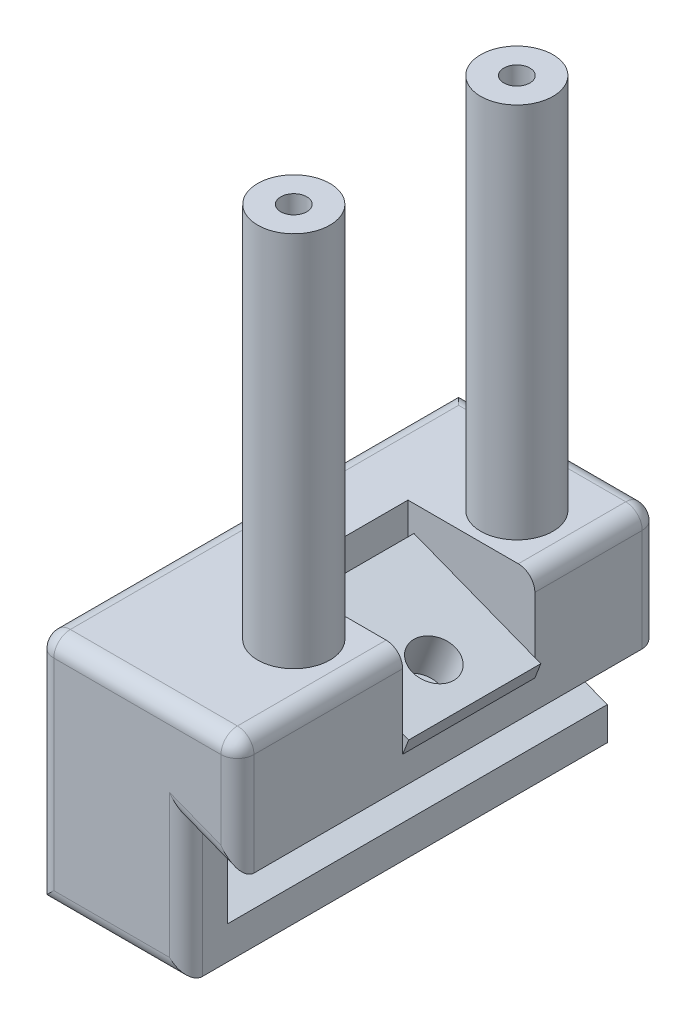
ISO-10303-21;
HEADER;
FILE_DESCRIPTION(('STEP AP214'),'2;1');
FILE_NAME('part.step','',(''),(''),'','','');
FILE_SCHEMA(('AUTOMOTIVE_DESIGN { 1 0 10303 214 1 1 1 1 }'));
ENDSEC;
DATA;
#1=APPLICATION_CONTEXT('core data for automotive mechanical design processes');
#2=APPLICATION_PROTOCOL_DEFINITION('international standard','automotive_design',2000,#1);
#3=PRODUCT_CONTEXT('',#1,'mechanical');
#4=PRODUCT('Part','Part','',(#3));
#5=PRODUCT_RELATED_PRODUCT_CATEGORY('part','',(#4));
#6=PRODUCT_DEFINITION_FORMATION('','',#4);
#7=PRODUCT_DEFINITION_CONTEXT('part definition',#1,'design');
#8=PRODUCT_DEFINITION('design','',#6,#7);
#9=PRODUCT_DEFINITION_SHAPE('','',#8);
#10=(LENGTH_UNIT() NAMED_UNIT(*) SI_UNIT(.MILLI.,.METRE.));
#11=(NAMED_UNIT(*) PLANE_ANGLE_UNIT() SI_UNIT($,.RADIAN.));
#12=(NAMED_UNIT(*) SI_UNIT($,.STERADIAN.) SOLID_ANGLE_UNIT());
#13=UNCERTAINTY_MEASURE_WITH_UNIT(LENGTH_MEASURE(1.E-05),#10,'distance_accuracy_value','');
#14=(GEOMETRIC_REPRESENTATION_CONTEXT(3) GLOBAL_UNCERTAINTY_ASSIGNED_CONTEXT((#13)) GLOBAL_UNIT_ASSIGNED_CONTEXT((#10,
#11,#12)) REPRESENTATION_CONTEXT('',''));
#15=CARTESIAN_POINT('',(0.,0.,0.));
#16=DIRECTION('',(0.,0.,1.));
#17=DIRECTION('',(1.,0.,0.));
#18=AXIS2_PLACEMENT_3D('',#15,#16,#17);
#19=CARTESIAN_POINT('',(0.,0.,39.37));
#20=DIRECTION('',(0.,0.,1.));
#21=DIRECTION('',(1.,0.,0.));
#22=AXIS2_PLACEMENT_3D('',#19,#20,#21);
#23=PLANE('',#22);
#24=DIRECTION('',(0.932004671541296,-0.362446261154948,0.));
#25=VECTOR('',#24,1.);
#26=CARTESIAN_POINT('',(31.6954077576272,24.4751367167012,39.37));
#27=LINE('',#26,#25);
#28=CARTESIAN_POINT('',(12.1920469111093,32.0597770459026,39.37));
#29=VERTEX_POINT('',#28);
#30=CARTESIAN_POINT('',(30.7747942542936,24.8331530791087,39.37));
#31=VERTEX_POINT('',#30);
#32=EDGE_CURVE('E58',#29,#31,#27,.T.);
#33=ORIENTED_EDGE('',*,*,#32,.F.);
#34=DIRECTION('',(-0.362446261154949,-0.932004671541296,0.));
#35=VECTOR('',#34,1.);
#36=CARTESIAN_POINT('',(12.1920469111093,32.0597770459026,39.37));
#37=LINE('',#36,#35);
#38=CARTESIAN_POINT('',(11.2714334077757,29.6924851801877,39.37));
#39=VERTEX_POINT('',#38);
#40=EDGE_CURVE('E235',#29,#39,#37,.T.);
#41=ORIENTED_EDGE('',*,*,#40,.T.);
#42=DIRECTION('',(0.,-1.,0.));
#43=VECTOR('',#42,1.);
#44=CARTESIAN_POINT('',(11.2714334077757,36.0424851801877,39.37));
#45=LINE('',#44,#43);
#46=CARTESIAN_POINT('',(11.2714334077757,36.0424851801877,39.37));
#47=VERTEX_POINT('',#46);
#48=EDGE_CURVE('E249',#47,#39,#45,.T.);
#49=ORIENTED_EDGE('',*,*,#48,.F.);
#50=DIRECTION('',(-1.,0.,0.));
#51=VECTOR('',#50,1.);
#52=CARTESIAN_POINT('',(30.7747942542936,36.0424851801877,39.37));
#53=LINE('',#52,#51);
#54=CARTESIAN_POINT('',(28.2347942542936,36.0424851801877,39.37));
#55=VERTEX_POINT('',#54);
#56=EDGE_CURVE('E239',#55,#47,#53,.T.);
#57=ORIENTED_EDGE('',*,*,#56,.F.);
#58=CARTESIAN_POINT('',(28.2347942542936,33.5024851801877,39.37));
#59=DIRECTION('',(0.,0.,1.));
#60=DIRECTION('',(1.,0.,0.));
#61=AXIS2_PLACEMENT_3D('',#58,#59,#60);
#62=CIRCLE('',#61,2.54);
#63=CARTESIAN_POINT('',(30.7747942542936,33.5024851801877,39.37));
#64=VERTEX_POINT('',#63);
#65=EDGE_CURVE('E11',#55,#64,#62,.F.);
#66=ORIENTED_EDGE('',*,*,#65,.T.);
#67=DIRECTION('',(0.,1.,0.));
#68=VECTOR('',#67,1.);
#69=CARTESIAN_POINT('',(30.7747942542936,22.1078448509863,39.37));
#70=LINE('',#69,#68);
#71=EDGE_CURVE('E278',#31,#64,#70,.T.);
#72=ORIENTED_EDGE('',*,*,#71,.F.);
#73=EDGE_LOOP('',(#33,#41,#49,#57,#66,#72));
#74=FACE_BOUND('',#73,.T.);
#75=ADVANCED_FACE('F41',(#74),#23,.F.);
#76=CARTESIAN_POINT('',(0.,0.,19.05));
#77=DIRECTION('',(0.,0.,-1.));
#78=DIRECTION('',(-1.,0.,0.));
#79=AXIS2_PLACEMENT_3D('',#76,#77,#78);
#80=PLANE('',#79);
#81=DIRECTION('',(-0.932004671541296,0.362446261154948,0.));
#82=VECTOR('',#81,1.);
#83=CARTESIAN_POINT('',(31.6954077576272,24.4751367167012,19.05));
#84=LINE('',#83,#82);
#85=CARTESIAN_POINT('',(30.7747942542936,24.8331530791087,19.05));
#86=VERTEX_POINT('',#85);
#87=CARTESIAN_POINT('',(12.1920469111093,32.0597770459026,19.05));
#88=VERTEX_POINT('',#87);
#89=EDGE_CURVE('E215',#86,#88,#84,.T.);
#90=ORIENTED_EDGE('',*,*,#89,.F.);
#91=DIRECTION('',(0.,-1.,0.));
#92=VECTOR('',#91,1.);
#93=CARTESIAN_POINT('',(30.7747942542936,0.,19.05));
#94=LINE('',#93,#92);
#95=CARTESIAN_POINT('',(30.7747942542936,33.5024851801877,19.05));
#96=VERTEX_POINT('',#95);
#97=EDGE_CURVE('E328',#96,#86,#94,.T.);
#98=ORIENTED_EDGE('',*,*,#97,.F.);
#99=CARTESIAN_POINT('',(28.2347942542936,33.5024851801877,19.05));
#100=DIRECTION('',(0.,0.,-1.));
#101=DIRECTION('',(-1.,0.,0.));
#102=AXIS2_PLACEMENT_3D('',#99,#100,#101);
#103=CIRCLE('',#102,2.54);
#104=CARTESIAN_POINT('',(28.2347942542936,36.0424851801877,19.05));
#105=VERTEX_POINT('',#104);
#106=EDGE_CURVE('E50',#96,#105,#103,.F.);
#107=ORIENTED_EDGE('',*,*,#106,.T.);
#108=DIRECTION('',(1.,0.,0.));
#109=VECTOR('',#108,1.);
#110=CARTESIAN_POINT('',(11.2714334077757,36.0424851801877,19.05));
#111=LINE('',#110,#109);
#112=CARTESIAN_POINT('',(11.2714334077757,36.0424851801877,19.05));
#113=VERTEX_POINT('',#112);
#114=EDGE_CURVE('E243',#113,#105,#111,.T.);
#115=ORIENTED_EDGE('',*,*,#114,.F.);
#116=DIRECTION('',(0.,-1.,0.));
#117=VECTOR('',#116,1.);
#118=CARTESIAN_POINT('',(11.2714334077757,36.0424851801877,19.05));
#119=LINE('',#118,#117);
#120=CARTESIAN_POINT('',(11.2714334077757,29.6924851801877,19.05));
#121=VERTEX_POINT('',#120);
#122=EDGE_CURVE('E246',#113,#121,#119,.T.);
#123=ORIENTED_EDGE('',*,*,#122,.T.);
#124=DIRECTION('',(-0.362446261154949,-0.932004671541296,0.));
#125=VECTOR('',#124,1.);
#126=CARTESIAN_POINT('',(12.1920469111093,32.0597770459026,19.05));
#127=LINE('',#126,#125);
#128=EDGE_CURVE('E231',#88,#121,#127,.T.);
#129=ORIENTED_EDGE('',*,*,#128,.F.);
#130=EDGE_LOOP('',(#90,#98,#107,#115,#123,#129));
#131=FACE_BOUND('',#130,.T.);
#132=ADVANCED_FACE('F451',(#131),#80,.F.);
#133=CARTESIAN_POINT('',(21.0231138310347,93.9544851801877,12.065));
#134=DIRECTION('',(0.,-1.,0.));
#135=DIRECTION('',(0.,0.,-1.));
#136=AXIS2_PLACEMENT_3D('',#133,#134,#135);
#137=CYLINDRICAL_SURFACE('',#136,5.55625);
#138=CARTESIAN_POINT('',(21.0231138310347,36.0424851801877,12.065));
#139=DIRECTION('',(0.,1.,0.));
#140=DIRECTION('',(0.,0.,1.));
#141=AXIS2_PLACEMENT_3D('',#138,#139,#140);
#142=CIRCLE('',#141,5.55625);
#143=CARTESIAN_POINT('',(21.0231138310347,36.0424851801877,17.62125));
#144=VERTEX_POINT('',#143);
#145=EDGE_CURVE('E255',#144,#144,#142,.T.);
#146=ORIENTED_EDGE('',*,*,#145,.T.);
#147=EDGE_LOOP('',(#146));
#148=FACE_BOUND('',#147,.T.);
#149=CARTESIAN_POINT('',(21.0231138310347,93.9544851801877,12.065));
#150=DIRECTION('',(0.,1.,0.));
#151=DIRECTION('',(0.,0.,1.));
#152=AXIS2_PLACEMENT_3D('',#149,#150,#151);
#153=CIRCLE('',#152,5.55625);
#154=CARTESIAN_POINT('',(21.0231138310347,93.9544851801877,17.62125));
#155=VERTEX_POINT('',#154);
#156=EDGE_CURVE('E325',#155,#155,#153,.T.);
#157=ORIENTED_EDGE('',*,*,#156,.F.);
#158=EDGE_LOOP('',(#157));
#159=FACE_BOUND('',#158,.T.);
#160=ADVANCED_FACE('F525',(#148,#159),#137,.T.);
#161=CARTESIAN_POINT('',(21.0231138310347,93.9544851801877,12.065));
#162=DIRECTION('',(0.,1.,0.));
#163=DIRECTION('',(0.,0.,1.));
#164=AXIS2_PLACEMENT_3D('',#161,#162,#163);
#165=PLANE('',#164);
#166=CARTESIAN_POINT('',(21.0231138310347,93.9544851801877,12.065));
#167=DIRECTION('',(0.,1.,0.));
#168=DIRECTION('',(0.,0.,1.));
#169=AXIS2_PLACEMENT_3D('',#166,#167,#168);
#170=CIRCLE('',#169,1.999996);
#171=CARTESIAN_POINT('',(21.0231138310347,93.9544851801877,14.064996));
#172=VERTEX_POINT('',#171);
#173=EDGE_CURVE('E265',#172,#172,#170,.T.);
#174=ORIENTED_EDGE('',*,*,#173,.F.);
#175=EDGE_LOOP('',(#174));
#176=FACE_BOUND('',#175,.T.);
#177=ORIENTED_EDGE('',*,*,#156,.T.);
#178=EDGE_LOOP('',(#177));
#179=FACE_BOUND('',#178,.T.);
#180=ADVANCED_FACE('F556',(#176,#179),#165,.T.);
#181=CARTESIAN_POINT('',(21.0231138310347,86.9544852101877,12.065));
#182=DIRECTION('',(0.,1.,0.));
#183=DIRECTION('',(0.,0.,1.));
#184=AXIS2_PLACEMENT_3D('',#181,#182,#183);
#185=CYLINDRICAL_SURFACE('',#184,1.999996);
#186=CARTESIAN_POINT('',(21.0231138310347,86.9544852101877,12.065));
#187=DIRECTION('',(0.,1.,0.));
#188=DIRECTION('',(0.,0.,1.));
#189=AXIS2_PLACEMENT_3D('',#186,#187,#188);
#190=CIRCLE('',#189,1.999996);
#191=CARTESIAN_POINT('',(21.0231138310347,86.9544852101877,14.064996));
#192=VERTEX_POINT('',#191);
#193=EDGE_CURVE('E261',#192,#192,#190,.T.);
#194=ORIENTED_EDGE('',*,*,#193,.F.);
#195=EDGE_LOOP('',(#194));
#196=FACE_BOUND('',#195,.T.);
#197=ORIENTED_EDGE('',*,*,#173,.T.);
#198=EDGE_LOOP('',(#197));
#199=FACE_BOUND('',#198,.T.);
#200=ADVANCED_FACE('F559',(#196,#199),#185,.F.);
#201=CARTESIAN_POINT('',(21.0231138310347,86.9544852101877,12.065));
#202=DIRECTION('',(0.,1.,0.));
#203=DIRECTION('',(0.,0.,1.));
#204=AXIS2_PLACEMENT_3D('',#201,#202,#203);
#205=PLANE('',#204);
#206=ORIENTED_EDGE('',*,*,#193,.T.);
#207=EDGE_LOOP('',(#206));
#208=FACE_BOUND('',#207,.T.);
#209=ADVANCED_FACE('F749',(#208),#205,.T.);
#210=CARTESIAN_POINT('',(11.2714334077757,36.0424851801877,39.37));
#211=DIRECTION('',(-1.,0.,0.));
#212=DIRECTION('',(0.,0.,1.));
#213=AXIS2_PLACEMENT_3D('',#210,#211,#212);
#214=PLANE('',#213);
#215=DIRECTION('',(0.,0.,-1.));
#216=VECTOR('',#215,1.);
#217=CARTESIAN_POINT('',(11.2714334077757,29.6924851801877,58.42));
#218=LINE('',#217,#216);
#219=EDGE_CURVE('E282',#39,#121,#218,.T.);
#220=ORIENTED_EDGE('',*,*,#219,.T.);
#221=ORIENTED_EDGE('',*,*,#122,.F.);
#222=DIRECTION('',(0.,0.,-1.));
#223=VECTOR('',#222,1.);
#224=CARTESIAN_POINT('',(11.2714334077757,36.0424851801877,39.37));
#225=LINE('',#224,#223);
#226=EDGE_CURVE('E241',#47,#113,#225,.T.);
#227=ORIENTED_EDGE('',*,*,#226,.F.);
#228=ORIENTED_EDGE('',*,*,#48,.T.);
#229=EDGE_LOOP('',(#220,#221,#227,#228));
#230=FACE_BOUND('',#229,.T.);
#231=ADVANCED_FACE('F468',(#230),#214,.F.);
#232=CARTESIAN_POINT('',(0.,36.0424851801877,0.));
#233=DIRECTION('',(0.,1.,0.));
#234=DIRECTION('',(0.,0.,1.));
#235=AXIS2_PLACEMENT_3D('',#232,#233,#234);
#236=PLANE('',#235);
#237=ORIENTED_EDGE('',*,*,#145,.F.);
#238=EDGE_LOOP('',(#237));
#239=FACE_BOUND('',#238,.T.);
#240=CARTESIAN_POINT('',(21.0231138310346,36.0424851801877,46.355));
#241=DIRECTION('',(0.,1.,0.));
#242=DIRECTION('',(0.,0.,1.));
#243=AXIS2_PLACEMENT_3D('',#240,#241,#242);
#244=CIRCLE('',#243,5.55625);
#245=CARTESIAN_POINT('',(21.0231138310346,36.0424851801877,51.91125));
#246=VERTEX_POINT('',#245);
#247=EDGE_CURVE('E254',#246,#246,#244,.T.);
#248=ORIENTED_EDGE('',*,*,#247,.F.);
#249=EDGE_LOOP('',(#248));
#250=FACE_BOUND('',#249,.T.);
#251=ORIENTED_EDGE('',*,*,#114,.T.);
#252=DIRECTION('',(0.,0.,-1.));
#253=VECTOR('',#252,1.);
#254=CARTESIAN_POINT('',(28.2347942542936,36.0424851801877,0.));
#255=LINE('',#254,#253);
#256=CARTESIAN_POINT('',(28.2347942542936,36.0424851801877,2.54));
#257=VERTEX_POINT('',#256);
#258=EDGE_CURVE('E362',#105,#257,#255,.T.);
#259=ORIENTED_EDGE('',*,*,#258,.T.);
#260=DIRECTION('',(-1.,0.,0.));
#261=VECTOR('',#260,1.);
#262=CARTESIAN_POINT('',(0.,36.0424851801877,2.54));
#263=LINE('',#262,#261);
#264=CARTESIAN_POINT('',(2.54,36.0424851801877,2.54));
#265=VERTEX_POINT('',#264);
#266=EDGE_CURVE('E360',#257,#265,#263,.T.);
#267=ORIENTED_EDGE('',*,*,#266,.T.);
#268=DIRECTION('',(0.,0.,1.));
#269=VECTOR('',#268,1.);
#270=CARTESIAN_POINT('',(2.54,36.0424851801877,64.77));
#271=LINE('',#270,#269);
#272=CARTESIAN_POINT('',(2.54,36.0424851801877,62.23));
#273=VERTEX_POINT('',#272);
#274=EDGE_CURVE('E358',#265,#273,#271,.T.);
#275=ORIENTED_EDGE('',*,*,#274,.T.);
#276=DIRECTION('',(1.,0.,0.));
#277=VECTOR('',#276,1.);
#278=CARTESIAN_POINT('',(30.7747942542936,36.0424851801877,62.23));
#279=LINE('',#278,#277);
#280=CARTESIAN_POINT('',(28.2347942542936,36.0424851801877,62.23));
#281=VERTEX_POINT('',#280);
#282=EDGE_CURVE('E356',#273,#281,#279,.T.);
#283=ORIENTED_EDGE('',*,*,#282,.T.);
#284=DIRECTION('',(0.,0.,-1.));
#285=VECTOR('',#284,1.);
#286=CARTESIAN_POINT('',(28.2347942542936,36.0424851801877,0.));
#287=LINE('',#286,#285);
#288=EDGE_CURVE('E354',#281,#55,#287,.T.);
#289=ORIENTED_EDGE('',*,*,#288,.T.);
#290=ORIENTED_EDGE('',*,*,#56,.T.);
#291=ORIENTED_EDGE('',*,*,#226,.T.);
#292=EDGE_LOOP('',(#251,#259,#267,#275,#283,#289,#290,#291));
#293=FACE_BOUND('',#292,.T.);
#294=ADVANCED_FACE('F438',(#239,#250,#293),#236,.T.);
#295=CARTESIAN_POINT('',(22.86,5.08,58.42));
#296=DIRECTION('',(-0.362446261154948,-0.932004671541296,0.));
#297=DIRECTION('',(0.932004671541296,-0.362446261154949,0.));
#298=AXIS2_PLACEMENT_3D('',#295,#296,#297);
#299=PLANE('',#298);
#300=DIRECTION('',(-0.932004671541296,0.362446261154949,0.));
#301=VECTOR('',#300,1.);
#302=CARTESIAN_POINT('',(22.86,5.08,0.));
#303=LINE('',#302,#301);
#304=CARTESIAN_POINT('',(22.86,5.08,0.));
#305=VERTEX_POINT('',#304);
#306=CARTESIAN_POINT('',(2.54,12.9822222222222,0.));
#307=VERTEX_POINT('',#306);
#308=EDGE_CURVE('E309',#305,#307,#303,.T.);
#309=ORIENTED_EDGE('',*,*,#308,.T.);
#310=CARTESIAN_POINT('',(2.54,12.9822222222222,2.54));
#311=DIRECTION('',(-0.362446261154948,-0.932004671541296,0.));
#312=DIRECTION('',(0.932004671541296,-0.362446261154949,0.));
#313=AXIS2_PLACEMENT_3D('',#310,#311,#312);
#314=ELLIPSE('',#313,2.72530822812239,2.54);
#315=CARTESIAN_POINT('',(0.,13.97,2.54000000000001));
#316=VERTEX_POINT('',#315);
#317=EDGE_CURVE('E387',#307,#316,#314,.F.);
#318=ORIENTED_EDGE('',*,*,#317,.T.);
#319=DIRECTION('',(0.,0.,-1.));
#320=VECTOR('',#319,1.);
#321=CARTESIAN_POINT('',(0.,13.97,58.42));
#322=LINE('',#321,#320);
#323=CARTESIAN_POINT('',(0.,13.97,58.42));
#324=VERTEX_POINT('',#323);
#325=EDGE_CURVE('E308',#324,#316,#322,.T.);
#326=ORIENTED_EDGE('',*,*,#325,.F.);
#327=DIRECTION('',(-0.932004671541296,0.362446261154949,0.));
#328=VECTOR('',#327,1.);
#329=CARTESIAN_POINT('',(22.86,5.08,58.42));
#330=LINE('',#329,#328);
#331=CARTESIAN_POINT('',(22.86,5.08,58.42));
#332=VERTEX_POINT('',#331);
#333=EDGE_CURVE('E305',#332,#324,#330,.T.);
#334=ORIENTED_EDGE('',*,*,#333,.F.);
#335=DIRECTION('',(0.,0.,-1.));
#336=VECTOR('',#335,1.);
#337=CARTESIAN_POINT('',(22.86,5.08,58.42));
#338=LINE('',#337,#336);
#339=EDGE_CURVE('E316',#332,#305,#338,.T.);
#340=ORIENTED_EDGE('',*,*,#339,.T.);
#341=EDGE_LOOP('',(#309,#318,#326,#334,#340));
#342=FACE_BOUND('',#341,.T.);
#343=ADVANCED_FACE('F545',(#342),#299,.F.);
#344=CARTESIAN_POINT('',(0.,0.,0.));
#345=DIRECTION('',(0.,0.,1.));
#346=DIRECTION('',(1.,0.,0.));
#347=AXIS2_PLACEMENT_3D('',#344,#345,#346);
#348=PLANE('',#347);
#349=DIRECTION('',(1.,0.,0.));
#350=VECTOR('',#349,1.);
#351=CARTESIAN_POINT('',(0.,0.,0.));
#352=LINE('',#351,#350);
#353=CARTESIAN_POINT('',(2.54,0.,0.));
#354=VERTEX_POINT('',#353);
#355=CARTESIAN_POINT('',(22.86,0.,0.));
#356=VERTEX_POINT('',#355);
#357=EDGE_CURVE('E304',#354,#356,#352,.T.);
#358=ORIENTED_EDGE('',*,*,#357,.F.);
#359=DIRECTION('',(0.,-1.,0.));
#360=VECTOR('',#359,1.);
#361=CARTESIAN_POINT('',(2.54,0.,0.));
#362=LINE('',#361,#360);
#363=EDGE_CURVE('E66',#354,#307,#362,.F.);
#364=ORIENTED_EDGE('',*,*,#363,.T.);
#365=ORIENTED_EDGE('',*,*,#308,.F.);
#366=DIRECTION('',(0.,1.,0.));
#367=VECTOR('',#366,1.);
#368=CARTESIAN_POINT('',(22.86,0.,0.));
#369=LINE('',#368,#367);
#370=EDGE_CURVE('E311',#356,#305,#369,.T.);
#371=ORIENTED_EDGE('',*,*,#370,.F.);
#372=EDGE_LOOP('',(#358,#364,#365,#371));
#373=FACE_BOUND('',#372,.T.);
#374=ADVANCED_FACE('F541',(#373),#348,.F.);
#375=CARTESIAN_POINT('',(0.,0.,58.42));
#376=DIRECTION('',(0.,1.,0.));
#377=DIRECTION('',(0.,0.,1.));
#378=AXIS2_PLACEMENT_3D('',#375,#376,#377);
#379=PLANE('',#378);
#380=DIRECTION('',(0.,0.,-1.));
#381=VECTOR('',#380,1.);
#382=CARTESIAN_POINT('',(22.86,0.,58.42));
#383=LINE('',#382,#381);
#384=CARTESIAN_POINT('',(22.86,0.,62.23));
#385=VERTEX_POINT('',#384);
#386=EDGE_CURVE('E319',#385,#356,#383,.T.);
#387=ORIENTED_EDGE('',*,*,#386,.F.);
#388=DIRECTION('',(1.,0.,0.));
#389=VECTOR('',#388,1.);
#390=CARTESIAN_POINT('',(0.,0.,62.23));
#391=LINE('',#390,#389);
#392=CARTESIAN_POINT('',(0.,0.,62.23));
#393=VERTEX_POINT('',#392);
#394=EDGE_CURVE('E380',#385,#393,#391,.F.);
#395=ORIENTED_EDGE('',*,*,#394,.T.);
#396=DIRECTION('',(0.,0.,-1.));
#397=VECTOR('',#396,1.);
#398=CARTESIAN_POINT('',(0.,0.,58.42));
#399=LINE('',#398,#397);
#400=CARTESIAN_POINT('',(0.,0.,2.54000000000001));
#401=VERTEX_POINT('',#400);
#402=EDGE_CURVE('E322',#393,#401,#399,.T.);
#403=ORIENTED_EDGE('',*,*,#402,.T.);
#404=CARTESIAN_POINT('',(2.54,0.,2.54));
#405=DIRECTION('',(0.,1.,0.));
#406=DIRECTION('',(0.,0.,1.));
#407=AXIS2_PLACEMENT_3D('',#404,#405,#406);
#408=CIRCLE('',#407,2.54);
#409=EDGE_CURVE('E378',#401,#354,#408,.F.);
#410=ORIENTED_EDGE('',*,*,#409,.T.);
#411=ORIENTED_EDGE('',*,*,#357,.T.);
#412=EDGE_LOOP('',(#387,#395,#403,#410,#411));
#413=FACE_BOUND('',#412,.T.);
#414=ADVANCED_FACE('F544',(#413),#379,.F.);
#415=CARTESIAN_POINT('',(22.86,0.,58.42));
#416=DIRECTION('',(-1.,0.,0.));
#417=DIRECTION('',(0.,0.,1.));
#418=AXIS2_PLACEMENT_3D('',#415,#416,#417);
#419=PLANE('',#418);
#420=DIRECTION('',(0.,0.,-1.));
#421=VECTOR('',#420,1.);
#422=CARTESIAN_POINT('',(22.86,20.8024851801877,79.1183938715696));
#423=LINE('',#422,#421);
#424=CARTESIAN_POINT('',(22.86,20.8024851801877,62.23));
#425=VERTEX_POINT('',#424);
#426=CARTESIAN_POINT('',(22.86,20.8024851801877,58.42));
#427=VERTEX_POINT('',#426);
#428=EDGE_CURVE('E258',#425,#427,#423,.T.);
#429=ORIENTED_EDGE('',*,*,#428,.F.);
#430=DIRECTION('',(0.,1.,0.));
#431=VECTOR('',#430,1.);
#432=CARTESIAN_POINT('',(22.86,0.,62.23));
#433=LINE('',#432,#431);
#434=EDGE_CURVE('E376',#425,#385,#433,.F.);
#435=ORIENTED_EDGE('',*,*,#434,.T.);
#436=ORIENTED_EDGE('',*,*,#386,.T.);
#437=ORIENTED_EDGE('',*,*,#370,.T.);
#438=ORIENTED_EDGE('',*,*,#339,.F.);
#439=DIRECTION('',(0.,1.,0.));
#440=VECTOR('',#439,1.);
#441=CARTESIAN_POINT('',(22.86,29.6924851801877,58.42));
#442=LINE('',#441,#440);
#443=EDGE_CURVE('E296',#332,#427,#442,.T.);
#444=ORIENTED_EDGE('',*,*,#443,.T.);
#445=EDGE_LOOP('',(#429,#435,#436,#437,#438,#444));
#446=FACE_BOUND('',#445,.T.);
#447=ADVANCED_FACE('F493',(#446),#419,.F.);
#448=CARTESIAN_POINT('',(0.,0.,58.42));
#449=DIRECTION('',(0.,0.,-1.));
#450=DIRECTION('',(-1.,0.,0.));
#451=AXIS2_PLACEMENT_3D('',#448,#449,#450);
#452=PLANE('',#451);
#453=DIRECTION('',(0.932004671541296,-0.362446261154949,0.));
#454=VECTOR('',#453,1.);
#455=CARTESIAN_POINT('',(0.,29.6924851801877,58.42));
#456=LINE('',#455,#454);
#457=CARTESIAN_POINT('',(0.,29.6924851801877,58.42));
#458=VERTEX_POINT('',#457);
#459=EDGE_CURVE('E285',#458,#427,#456,.T.);
#460=ORIENTED_EDGE('',*,*,#459,.T.);
#461=ORIENTED_EDGE('',*,*,#443,.F.);
#462=ORIENTED_EDGE('',*,*,#333,.T.);
#463=DIRECTION('',(0.,-1.,0.));
#464=VECTOR('',#463,1.);
#465=CARTESIAN_POINT('',(0.,0.,58.42));
#466=LINE('',#465,#464);
#467=EDGE_CURVE('E301',#458,#324,#466,.T.);
#468=ORIENTED_EDGE('',*,*,#467,.F.);
#469=EDGE_LOOP('',(#460,#461,#462,#468));
#470=FACE_BOUND('',#469,.T.);
#471=ADVANCED_FACE('F498',(#470),#452,.T.);
#472=CARTESIAN_POINT('',(12.9761112602795,-5.04765437899759,29.21));
#473=DIRECTION('',(0.362446261154949,0.932004671541296,0.));
#474=DIRECTION('',(-0.932004671541296,0.362446261154949,0.));
#475=AXIS2_PLACEMENT_3D('',#472,#473,#474);
#476=CYLINDRICAL_SURFACE('',#475,3.3);
#477=CARTESIAN_POINT('',(23.0067496857585,20.7454158579483,29.21));
#478=DIRECTION('',(-0.362446261154948,-0.932004671541296,0.));
#479=DIRECTION('',(0.932004671541296,-0.362446261154949,0.));
#480=AXIS2_PLACEMENT_3D('',#477,#478,#479);
#481=CIRCLE('',#480,3.3);
#482=CARTESIAN_POINT('',(26.0823651018447,19.549343196137,29.21));
#483=VERTEX_POINT('',#482);
#484=EDGE_CURVE('E275',#483,#483,#481,.F.);
#485=ORIENTED_EDGE('',*,*,#484,.F.);
#486=EDGE_LOOP('',(#485));
#487=FACE_BOUND('',#486,.T.);
#488=CARTESIAN_POINT('',(25.4080608753682,26.9202160598019,29.21));
#489=DIRECTION('',(0.362446261154949,0.932004671541296,0.));
#490=DIRECTION('',(-0.932004671541296,0.362446261154949,0.));
#491=AXIS2_PLACEMENT_3D('',#488,#489,#490);
#492=CIRCLE('',#491,3.3);
#493=CARTESIAN_POINT('',(22.3324454592819,28.1162887216133,29.21));
#494=VERTEX_POINT('',#493);
#495=EDGE_CURVE('E225',#494,#494,#492,.T.);
#496=ORIENTED_EDGE('',*,*,#495,.T.);
#497=EDGE_LOOP('',(#496));
#498=FACE_BOUND('',#497,.T.);
#499=ADVANCED_FACE('F529',(#487,#498),#476,.F.);
#500=CARTESIAN_POINT('',(0.,29.6924851801877,0.));
#501=DIRECTION('',(-0.362446261154948,-0.932004671541296,0.));
#502=DIRECTION('',(0.932004671541296,-0.362446261154949,0.));
#503=AXIS2_PLACEMENT_3D('',#500,#501,#502);
#504=PLANE('',#503);
#505=ORIENTED_EDGE('',*,*,#484,.T.);
#506=EDGE_LOOP('',(#505));
#507=FACE_BOUND('',#506,.T.);
#508=DIRECTION('',(0.,0.,1.));
#509=VECTOR('',#508,1.);
#510=CARTESIAN_POINT('',(30.7747942542936,17.7245096368513,0.));
#511=LINE('',#510,#509);
#512=CARTESIAN_POINT('',(30.7747942542936,17.7245096368513,2.54));
#513=VERTEX_POINT('',#512);
#514=CARTESIAN_POINT('',(30.7747942542936,17.7245096368513,62.23));
#515=VERTEX_POINT('',#514);
#516=EDGE_CURVE('E293',#513,#515,#511,.T.);
#517=ORIENTED_EDGE('',*,*,#516,.T.);
#518=DIRECTION('',(-0.932004671541296,0.362446261154949,0.));
#519=VECTOR('',#518,1.);
#520=CARTESIAN_POINT('',(22.86,20.8024851801877,62.23));
#521=LINE('',#520,#519);
#522=EDGE_CURVE('E374',#515,#425,#521,.T.);
#523=ORIENTED_EDGE('',*,*,#522,.T.);
#524=ORIENTED_EDGE('',*,*,#428,.T.);
#525=ORIENTED_EDGE('',*,*,#459,.F.);
#526=DIRECTION('',(0.,0.,1.));
#527=VECTOR('',#526,1.);
#528=CARTESIAN_POINT('',(0.,29.6924851801877,0.));
#529=LINE('',#528,#527);
#530=CARTESIAN_POINT('',(0.,29.6924851801877,0.));
#531=VERTEX_POINT('',#530);
#532=EDGE_CURVE('E290',#531,#458,#529,.T.);
#533=ORIENTED_EDGE('',*,*,#532,.F.);
#534=DIRECTION('',(0.932004671541296,-0.362446261154949,0.));
#535=VECTOR('',#534,1.);
#536=CARTESIAN_POINT('',(0.,29.6924851801877,0.));
#537=LINE('',#536,#535);
#538=CARTESIAN_POINT('',(28.2347942542936,18.7122874146291,0.));
#539=VERTEX_POINT('',#538);
#540=EDGE_CURVE('E287',#531,#539,#537,.T.);
#541=ORIENTED_EDGE('',*,*,#540,.T.);
#542=CARTESIAN_POINT('',(28.2347942542936,18.7122874146291,2.54));
#543=DIRECTION('',(-0.362446261154948,-0.932004671541296,0.));
#544=DIRECTION('',(0.932004671541296,-0.362446261154949,0.));
#545=AXIS2_PLACEMENT_3D('',#542,#543,#544);
#546=ELLIPSE('',#545,2.72530822812239,2.54);
#547=EDGE_CURVE('E372',#539,#513,#546,.T.);
#548=ORIENTED_EDGE('',*,*,#547,.T.);
#549=EDGE_LOOP('',(#517,#523,#524,#525,#533,#541,#548));
#550=FACE_BOUND('',#549,.T.);
#551=ADVANCED_FACE('F491',(#507,#550),#504,.T.);
#552=CARTESIAN_POINT('',(0.,0.,64.77));
#553=DIRECTION('',(0.,0.,-1.));
#554=DIRECTION('',(-1.,0.,0.));
#555=AXIS2_PLACEMENT_3D('',#552,#553,#554);
#556=PLANE('',#555);
#557=DIRECTION('',(1.,0.,0.));
#558=VECTOR('',#557,1.);
#559=CARTESIAN_POINT('',(0.,33.5024851801877,64.77));
#560=LINE('',#559,#558);
#561=CARTESIAN_POINT('',(28.2347942542936,33.5024851801877,64.77));
#562=VERTEX_POINT('',#561);
#563=CARTESIAN_POINT('',(2.54,33.5024851801877,64.77));
#564=VERTEX_POINT('',#563);
#565=EDGE_CURVE('E341',#562,#564,#560,.F.);
#566=ORIENTED_EDGE('',*,*,#565,.T.);
#567=DIRECTION('',(0.,-1.,0.));
#568=VECTOR('',#567,1.);
#569=CARTESIAN_POINT('',(2.54,0.,64.77));
#570=LINE('',#569,#568);
#571=CARTESIAN_POINT('',(2.54,2.54,64.77));
#572=VERTEX_POINT('',#571);
#573=EDGE_CURVE('E343',#564,#572,#570,.T.);
#574=ORIENTED_EDGE('',*,*,#573,.T.);
#575=DIRECTION('',(1.,0.,0.));
#576=VECTOR('',#575,1.);
#577=CARTESIAN_POINT('',(0.,2.54,64.77));
#578=LINE('',#577,#576);
#579=CARTESIAN_POINT('',(20.32,2.54,64.77));
#580=VERTEX_POINT('',#579);
#581=EDGE_CURVE('E331',#572,#580,#578,.T.);
#582=ORIENTED_EDGE('',*,*,#581,.T.);
#583=DIRECTION('',(0.,1.,0.));
#584=VECTOR('',#583,1.);
#585=CARTESIAN_POINT('',(20.32,0.,64.77));
#586=LINE('',#585,#584);
#587=CARTESIAN_POINT('',(20.32,24.5155711860879,64.77));
#588=VERTEX_POINT('',#587);
#589=EDGE_CURVE('E335',#580,#588,#586,.T.);
#590=ORIENTED_EDGE('',*,*,#589,.T.);
#591=DIRECTION('',(-0.932004671541296,0.362446261154949,0.));
#592=VECTOR('',#591,1.);
#593=CARTESIAN_POINT('',(31.6954077576272,20.0918015025662,64.77));
#594=LINE('',#593,#592);
#595=CARTESIAN_POINT('',(28.2347942542936,21.4375956427515,64.77));
#596=VERTEX_POINT('',#595);
#597=EDGE_CURVE('E337',#588,#596,#594,.F.);
#598=ORIENTED_EDGE('',*,*,#597,.T.);
#599=DIRECTION('',(0.,-1.,0.));
#600=VECTOR('',#599,1.);
#601=CARTESIAN_POINT('',(28.2347942542936,36.0424851801877,64.77));
#602=LINE('',#601,#600);
#603=EDGE_CURVE('E339',#596,#562,#602,.F.);
#604=ORIENTED_EDGE('',*,*,#603,.T.);
#605=EDGE_LOOP('',(#566,#574,#582,#590,#598,#604));
#606=FACE_BOUND('',#605,.T.);
#607=ADVANCED_FACE('F533',(#606),#556,.F.);
#608=CARTESIAN_POINT('',(0.,13.97,58.42));
#609=DIRECTION('',(1.,0.,0.));
#610=DIRECTION('',(0.,1.,0.));
#611=AXIS2_PLACEMENT_3D('',#608,#609,#610);
#612=PLANE('',#611);
#613=ORIENTED_EDGE('',*,*,#325,.T.);
#614=DIRECTION('',(0.,-1.,0.));
#615=VECTOR('',#614,1.);
#616=CARTESIAN_POINT('',(0.,13.97,2.54));
#617=LINE('',#616,#615);
#618=EDGE_CURVE('E351',#316,#401,#617,.T.);
#619=ORIENTED_EDGE('',*,*,#618,.T.);
#620=ORIENTED_EDGE('',*,*,#402,.F.);
#621=DIRECTION('',(0.,-1.,0.));
#622=VECTOR('',#621,1.);
#623=CARTESIAN_POINT('',(0.,13.97,62.23));
#624=LINE('',#623,#622);
#625=CARTESIAN_POINT('',(0.,33.5024851801877,62.23));
#626=VERTEX_POINT('',#625);
#627=EDGE_CURVE('E348',#393,#626,#624,.F.);
#628=ORIENTED_EDGE('',*,*,#627,.T.);
#629=DIRECTION('',(0.,0.,1.));
#630=VECTOR('',#629,1.);
#631=CARTESIAN_POINT('',(0.,33.5024851801877,0.));
#632=LINE('',#631,#630);
#633=CARTESIAN_POINT('',(0.,33.5024851801877,0.));
#634=VERTEX_POINT('',#633);
#635=EDGE_CURVE('E346',#626,#634,#632,.F.);
#636=ORIENTED_EDGE('',*,*,#635,.T.);
#637=DIRECTION('',(0.,-1.,0.));
#638=VECTOR('',#637,1.);
#639=CARTESIAN_POINT('',(0.,36.0424851801877,0.));
#640=LINE('',#639,#638);
#641=EDGE_CURVE('E252',#634,#531,#640,.T.);
#642=ORIENTED_EDGE('',*,*,#641,.T.);
#643=ORIENTED_EDGE('',*,*,#532,.T.);
#644=ORIENTED_EDGE('',*,*,#467,.T.);
#645=EDGE_LOOP('',(#613,#619,#620,#628,#636,#642,#643,#644));
#646=FACE_BOUND('',#645,.T.);
#647=ADVANCED_FACE('F537',(#646),#612,.F.);
#648=CARTESIAN_POINT('',(0.,0.,0.));
#649=DIRECTION('',(0.,0.,-1.));
#650=DIRECTION('',(-1.,0.,0.));
#651=AXIS2_PLACEMENT_3D('',#648,#649,#650);
#652=PLANE('',#651);
#653=DIRECTION('',(-1.,0.,0.));
#654=VECTOR('',#653,1.);
#655=CARTESIAN_POINT('',(0.,33.5024851801877,0.));
#656=LINE('',#655,#654);
#657=CARTESIAN_POINT('',(28.2347942542936,33.5024851801877,0.));
#658=VERTEX_POINT('',#657);
#659=EDGE_CURVE('E382',#634,#658,#656,.F.);
#660=ORIENTED_EDGE('',*,*,#659,.T.);
#661=DIRECTION('',(0.,-1.,0.));
#662=VECTOR('',#661,1.);
#663=CARTESIAN_POINT('',(28.2347942542936,0.,0.));
#664=LINE('',#663,#662);
#665=EDGE_CURVE('E384',#658,#539,#664,.T.);
#666=ORIENTED_EDGE('',*,*,#665,.T.);
#667=ORIENTED_EDGE('',*,*,#540,.F.);
#668=ORIENTED_EDGE('',*,*,#641,.F.);
#669=EDGE_LOOP('',(#660,#666,#667,#668));
#670=FACE_BOUND('',#669,.T.);
#671=ADVANCED_FACE('F506',(#670),#652,.T.);
#672=CARTESIAN_POINT('',(30.7747942542936,0.,19.05));
#673=DIRECTION('',(1.,0.,0.));
#674=DIRECTION('',(0.,0.,-1.));
#675=AXIS2_PLACEMENT_3D('',#672,#673,#674);
#676=PLANE('',#675);
#677=ORIENTED_EDGE('',*,*,#516,.F.);
#678=DIRECTION('',(0.,-1.,0.));
#679=VECTOR('',#678,1.);
#680=CARTESIAN_POINT('',(30.7747942542936,0.,2.54));
#681=LINE('',#680,#679);
#682=CARTESIAN_POINT('',(30.7747942542936,33.5024851801877,2.54));
#683=VERTEX_POINT('',#682);
#684=EDGE_CURVE('E370',#513,#683,#681,.F.);
#685=ORIENTED_EDGE('',*,*,#684,.T.);
#686=DIRECTION('',(0.,0.,-1.));
#687=VECTOR('',#686,1.);
#688=CARTESIAN_POINT('',(30.7747942542936,33.5024851801877,19.05));
#689=LINE('',#688,#687);
#690=EDGE_CURVE('E368',#683,#96,#689,.F.);
#691=ORIENTED_EDGE('',*,*,#690,.T.);
#692=ORIENTED_EDGE('',*,*,#97,.T.);
#693=CARTESIAN_POINT('',(30.7747942542936,22.1078448509863,19.05));
#694=VERTEX_POINT('',#693);
#695=EDGE_CURVE('E212',#86,#694,#94,.T.);
#696=ORIENTED_EDGE('',*,*,#695,.T.);
#697=DIRECTION('',(0.,0.,-1.));
#698=VECTOR('',#697,1.);
#699=CARTESIAN_POINT('',(30.7747942542936,22.1078448509863,58.42));
#700=LINE('',#699,#698);
#701=CARTESIAN_POINT('',(30.7747942542936,22.1078448509863,39.37));
#702=VERTEX_POINT('',#701);
#703=EDGE_CURVE('E229',#702,#694,#700,.T.);
#704=ORIENTED_EDGE('',*,*,#703,.F.);
#705=EDGE_CURVE('E279',#702,#31,#70,.T.);
#706=ORIENTED_EDGE('',*,*,#705,.T.);
#707=ORIENTED_EDGE('',*,*,#71,.T.);
#708=DIRECTION('',(0.,0.,-1.));
#709=VECTOR('',#708,1.);
#710=CARTESIAN_POINT('',(30.7747942542936,33.5024851801877,19.05));
#711=LINE('',#710,#709);
#712=CARTESIAN_POINT('',(30.7747942542936,33.5024851801877,62.23));
#713=VERTEX_POINT('',#712);
#714=EDGE_CURVE('E364',#64,#713,#711,.F.);
#715=ORIENTED_EDGE('',*,*,#714,.T.);
#716=DIRECTION('',(0.,-1.,0.));
#717=VECTOR('',#716,1.);
#718=CARTESIAN_POINT('',(30.7747942542936,17.7245096368513,62.23));
#719=LINE('',#718,#717);
#720=EDGE_CURVE('E366',#713,#515,#719,.T.);
#721=ORIENTED_EDGE('',*,*,#720,.T.);
#722=EDGE_LOOP('',(#677,#685,#691,#692,#696,#704,#706,#707,#715,#721));
#723=FACE_BOUND('',#722,.T.);
#724=ADVANCED_FACE('F449',(#723),#676,.T.);
#725=CARTESIAN_POINT('',(21.0231138310346,86.9544852101877,46.355));
#726=DIRECTION('',(0.,1.,0.));
#727=DIRECTION('',(0.,0.,1.));
#728=AXIS2_PLACEMENT_3D('',#725,#726,#727);
#729=PLANE('',#728);
#730=CARTESIAN_POINT('',(21.0231138310346,86.9544852101877,46.355));
#731=DIRECTION('',(0.,1.,0.));
#732=DIRECTION('',(0.,0.,1.));
#733=AXIS2_PLACEMENT_3D('',#730,#731,#732);
#734=CIRCLE('',#733,1.999996);
#735=CARTESIAN_POINT('',(21.0231138310346,86.9544852101877,48.354996));
#736=VERTEX_POINT('',#735);
#737=EDGE_CURVE('E260',#736,#736,#734,.T.);
#738=ORIENTED_EDGE('',*,*,#737,.T.);
#739=EDGE_LOOP('',(#738));
#740=FACE_BOUND('',#739,.T.);
#741=ADVANCED_FACE('F567',(#740),#729,.T.);
#742=CARTESIAN_POINT('',(21.0231138310346,86.9544852101877,46.355));
#743=DIRECTION('',(0.,1.,0.));
#744=DIRECTION('',(0.,0.,1.));
#745=AXIS2_PLACEMENT_3D('',#742,#743,#744);
#746=CYLINDRICAL_SURFACE('',#745,1.999996);
#747=ORIENTED_EDGE('',*,*,#737,.F.);
#748=EDGE_LOOP('',(#747));
#749=FACE_BOUND('',#748,.T.);
#750=CARTESIAN_POINT('',(21.0231138310346,93.9544851801877,46.355));
#751=DIRECTION('',(0.,1.,0.));
#752=DIRECTION('',(0.,0.,1.));
#753=AXIS2_PLACEMENT_3D('',#750,#751,#752);
#754=CIRCLE('',#753,1.999996);
#755=CARTESIAN_POINT('',(21.0231138310346,93.9544851801877,48.354996));
#756=VERTEX_POINT('',#755);
#757=EDGE_CURVE('E268',#756,#756,#754,.T.);
#758=ORIENTED_EDGE('',*,*,#757,.T.);
#759=EDGE_LOOP('',(#758));
#760=FACE_BOUND('',#759,.T.);
#761=ADVANCED_FACE('F756',(#749,#760),#746,.F.);
#762=CARTESIAN_POINT('',(21.0231138310346,93.9544851801877,46.355));
#763=DIRECTION('',(0.,1.,0.));
#764=DIRECTION('',(0.,0.,1.));
#765=AXIS2_PLACEMENT_3D('',#762,#763,#764);
#766=PLANE('',#765);
#767=ORIENTED_EDGE('',*,*,#757,.F.);
#768=EDGE_LOOP('',(#767));
#769=FACE_BOUND('',#768,.T.);
#770=CARTESIAN_POINT('',(21.0231138310346,93.9544851801877,46.355));
#771=DIRECTION('',(0.,1.,0.));
#772=DIRECTION('',(0.,0.,1.));
#773=AXIS2_PLACEMENT_3D('',#770,#771,#772);
#774=CIRCLE('',#773,5.55625);
#775=CARTESIAN_POINT('',(21.0231138310346,93.9544851801877,51.91125));
#776=VERTEX_POINT('',#775);
#777=EDGE_CURVE('E264',#776,#776,#774,.T.);
#778=ORIENTED_EDGE('',*,*,#777,.T.);
#779=EDGE_LOOP('',(#778));
#780=FACE_BOUND('',#779,.T.);
#781=ADVANCED_FACE('F516',(#769,#780),#766,.T.);
#782=CARTESIAN_POINT('',(21.0231138310346,93.9544851801877,46.355));
#783=DIRECTION('',(0.,-1.,0.));
#784=DIRECTION('',(0.,0.,-1.));
#785=AXIS2_PLACEMENT_3D('',#782,#783,#784);
#786=CYLINDRICAL_SURFACE('',#785,5.55625);
#787=ORIENTED_EDGE('',*,*,#247,.T.);
#788=EDGE_LOOP('',(#787));
#789=FACE_BOUND('',#788,.T.);
#790=ORIENTED_EDGE('',*,*,#777,.F.);
#791=EDGE_LOOP('',(#790));
#792=FACE_BOUND('',#791,.T.);
#793=ADVANCED_FACE('F509',(#789,#792),#786,.T.);
#794=CARTESIAN_POINT('',(28.2347942542936,0.,2.54));
#795=DIRECTION('',(0.,-1.,0.));
#796=DIRECTION('',(0.,0.,-1.));
#797=AXIS2_PLACEMENT_3D('',#794,#795,#796);
#798=CYLINDRICAL_SURFACE('',#797,2.54);
#799=ORIENTED_EDGE('',*,*,#547,.F.);
#800=ORIENTED_EDGE('',*,*,#665,.F.);
#801=CARTESIAN_POINT('',(28.2347942542936,33.5024851801877,2.54));
#802=DIRECTION('',(0.,1.,0.));
#803=DIRECTION('',(0.,0.,1.));
#804=AXIS2_PLACEMENT_3D('',#801,#802,#803);
#805=CIRCLE('',#804,2.54);
#806=EDGE_CURVE('E45',#683,#658,#805,.T.);
#807=ORIENTED_EDGE('',*,*,#806,.F.);
#808=ORIENTED_EDGE('',*,*,#684,.F.);
#809=EDGE_LOOP('',(#799,#800,#807,#808));
#810=FACE_BOUND('',#809,.T.);
#811=ADVANCED_FACE('F507',(#810),#798,.T.);
#812=CARTESIAN_POINT('',(28.2347942542936,33.5024851801877,0.));
#813=DIRECTION('',(0.,0.,-1.));
#814=DIRECTION('',(-1.,0.,0.));
#815=AXIS2_PLACEMENT_3D('',#812,#813,#814);
#816=CYLINDRICAL_SURFACE('',#815,2.54);
#817=ORIENTED_EDGE('',*,*,#106,.F.);
#818=ORIENTED_EDGE('',*,*,#690,.F.);
#819=CARTESIAN_POINT('',(28.2347942542936,33.5024851801877,2.54));
#820=DIRECTION('',(0.,0.,-1.));
#821=DIRECTION('',(-1.,0.,0.));
#822=AXIS2_PLACEMENT_3D('',#819,#820,#821);
#823=CIRCLE('',#822,2.54);
#824=EDGE_CURVE('E420',#257,#683,#823,.T.);
#825=ORIENTED_EDGE('',*,*,#824,.F.);
#826=ORIENTED_EDGE('',*,*,#258,.F.);
#827=EDGE_LOOP('',(#817,#818,#825,#826));
#828=FACE_BOUND('',#827,.T.);
#829=ADVANCED_FACE('F445',(#828),#816,.T.);
#830=CARTESIAN_POINT('',(28.2347942542936,33.5024851801877,2.54));
#831=DIRECTION('',(1.,0.,0.));
#832=DIRECTION('',(0.,0.,-1.));
#833=AXIS2_PLACEMENT_3D('',#830,#831,#832);
#834=SPHERICAL_SURFACE('',#833,2.54);
#835=ORIENTED_EDGE('',*,*,#824,.T.);
#836=ORIENTED_EDGE('',*,*,#806,.T.);
#837=CARTESIAN_POINT('',(28.2347942542936,33.5024851801877,2.54));
#838=DIRECTION('',(1.,0.,0.));
#839=DIRECTION('',(0.,0.,-1.));
#840=AXIS2_PLACEMENT_3D('',#837,#838,#839);
#841=CIRCLE('',#840,2.54);
#842=EDGE_CURVE('E418',#257,#658,#841,.F.);
#843=ORIENTED_EDGE('',*,*,#842,.F.);
#844=EDGE_LOOP('',(#835,#836,#843));
#845=FACE_BOUND('',#844,.T.);
#846=ADVANCED_FACE('F427',(#845),#834,.T.);
#847=CARTESIAN_POINT('',(28.2347942542936,33.5024851801877,0.));
#848=DIRECTION('',(0.,0.,-1.));
#849=DIRECTION('',(-1.,0.,0.));
#850=AXIS2_PLACEMENT_3D('',#847,#848,#849);
#851=CYLINDRICAL_SURFACE('',#850,2.54);
#852=ORIENTED_EDGE('',*,*,#65,.F.);
#853=ORIENTED_EDGE('',*,*,#288,.F.);
#854=CARTESIAN_POINT('',(28.2347942542936,33.5024851801877,62.23));
#855=DIRECTION('',(0.,0.,1.));
#856=DIRECTION('',(1.,0.,0.));
#857=AXIS2_PLACEMENT_3D('',#854,#855,#856);
#858=CIRCLE('',#857,2.54);
#859=EDGE_CURVE('E415',#713,#281,#858,.T.);
#860=ORIENTED_EDGE('',*,*,#859,.F.);
#861=ORIENTED_EDGE('',*,*,#714,.F.);
#862=EDGE_LOOP('',(#852,#853,#860,#861));
#863=FACE_BOUND('',#862,.T.);
#864=ADVANCED_FACE('F474',(#863),#851,.T.);
#865=CARTESIAN_POINT('',(28.2347942542936,0.,62.23));
#866=DIRECTION('',(0.,1.,0.));
#867=DIRECTION('',(0.,0.,1.));
#868=AXIS2_PLACEMENT_3D('',#865,#866,#867);
#869=CYLINDRICAL_SURFACE('',#868,2.54);
#870=CARTESIAN_POINT('',(28.2347942542936,21.4375956427515,62.23));
#871=DIRECTION('',(0.825362423773626,0.564603284990909,0.));
#872=DIRECTION('',(0.564603284990909,-0.825362423773626,0.));
#873=AXIS2_PLACEMENT_3D('',#870,#871,#872);
#874=ELLIPSE('',#873,4.49873400938661,2.54);
#875=EDGE_CURVE('E409',#515,#596,#874,.F.);
#876=ORIENTED_EDGE('',*,*,#875,.F.);
#877=ORIENTED_EDGE('',*,*,#720,.F.);
#878=CARTESIAN_POINT('',(28.2347942542936,33.5024851801877,62.23));
#879=DIRECTION('',(0.,1.,0.));
#880=DIRECTION('',(0.,0.,1.));
#881=AXIS2_PLACEMENT_3D('',#878,#879,#880);
#882=CIRCLE('',#881,2.54);
#883=EDGE_CURVE('E412',#562,#713,#882,.T.);
#884=ORIENTED_EDGE('',*,*,#883,.F.);
#885=ORIENTED_EDGE('',*,*,#603,.F.);
#886=EDGE_LOOP('',(#876,#877,#884,#885));
#887=FACE_BOUND('',#886,.T.);
#888=ADVANCED_FACE('F480',(#887),#869,.T.);
#889=CARTESIAN_POINT('',(0.,33.5024851801877,2.54));
#890=DIRECTION('',(-1.,0.,0.));
#891=DIRECTION('',(0.,0.,1.));
#892=AXIS2_PLACEMENT_3D('',#889,#890,#891);
#893=CYLINDRICAL_SURFACE('',#892,2.54);
#894=ORIENTED_EDGE('',*,*,#842,.T.);
#895=ORIENTED_EDGE('',*,*,#659,.F.);
#896=CARTESIAN_POINT('',(2.54,33.5024851801877,2.54));
#897=DIRECTION('',(0.707106781186547,0.,-0.707106781186547));
#898=DIRECTION('',(-0.707106781186547,0.,-0.707106781186547));
#899=AXIS2_PLACEMENT_3D('',#896,#897,#898);
#900=ELLIPSE('',#899,3.59210244842766,2.54);
#901=EDGE_CURVE('E406',#265,#634,#900,.F.);
#902=ORIENTED_EDGE('',*,*,#901,.F.);
#903=ORIENTED_EDGE('',*,*,#266,.F.);
#904=EDGE_LOOP('',(#894,#895,#902,#903));
#905=FACE_BOUND('',#904,.T.);
#906=ADVANCED_FACE('F434',(#905),#893,.T.);
#907=CARTESIAN_POINT('',(28.2347942542936,33.5024851801877,62.23));
#908=DIRECTION('',(1.,0.,0.));
#909=DIRECTION('',(0.,0.,-1.));
#910=AXIS2_PLACEMENT_3D('',#907,#908,#909);
#911=SPHERICAL_SURFACE('',#910,2.54);
#912=ORIENTED_EDGE('',*,*,#883,.T.);
#913=ORIENTED_EDGE('',*,*,#859,.T.);
#914=CARTESIAN_POINT('',(28.2347942542936,33.5024851801877,62.23));
#915=DIRECTION('',(1.,0.,0.));
#916=DIRECTION('',(0.,0.,-1.));
#917=AXIS2_PLACEMENT_3D('',#914,#915,#916);
#918=CIRCLE('',#917,2.54);
#919=EDGE_CURVE('E403',#562,#281,#918,.F.);
#920=ORIENTED_EDGE('',*,*,#919,.F.);
#921=EDGE_LOOP('',(#912,#913,#920));
#922=FACE_BOUND('',#921,.T.);
#923=ADVANCED_FACE('F594',(#922),#911,.T.);
#924=CARTESIAN_POINT('',(0.920613503333569,32.0597770459026,62.23));
#925=DIRECTION('',(0.932004671541296,-0.362446261154949,0.));
#926=DIRECTION('',(0.362446261154948,0.932004671541296,0.));
#927=AXIS2_PLACEMENT_3D('',#924,#925,#926);
#928=CYLINDRICAL_SURFACE('',#927,2.54);
#929=ORIENTED_EDGE('',*,*,#875,.T.);
#930=ORIENTED_EDGE('',*,*,#597,.F.);
#931=CARTESIAN_POINT('',(20.32,24.5155711860879,62.23));
#932=DIRECTION('',(0.825362423773626,0.564603284990909,0.));
#933=DIRECTION('',(0.564603284990909,-0.825362423773626,0.));
#934=AXIS2_PLACEMENT_3D('',#931,#932,#933);
#935=ELLIPSE('',#934,4.49873400938661,2.54);
#936=EDGE_CURVE('E400',#425,#588,#935,.F.);
#937=ORIENTED_EDGE('',*,*,#936,.F.);
#938=ORIENTED_EDGE('',*,*,#522,.F.);
#939=EDGE_LOOP('',(#929,#930,#937,#938));
#940=FACE_BOUND('',#939,.T.);
#941=ADVANCED_FACE('F487',(#940),#928,.T.);
#942=CARTESIAN_POINT('',(2.54,33.5024851801877,0.));
#943=DIRECTION('',(0.,0.,-1.));
#944=DIRECTION('',(-1.,0.,0.));
#945=AXIS2_PLACEMENT_3D('',#942,#943,#944);
#946=CYLINDRICAL_SURFACE('',#945,2.54);
#947=ORIENTED_EDGE('',*,*,#901,.T.);
#948=ORIENTED_EDGE('',*,*,#635,.F.);
#949=CARTESIAN_POINT('',(2.54,33.5024851801877,62.23));
#950=DIRECTION('',(0.,0.,1.));
#951=DIRECTION('',(1.,0.,0.));
#952=AXIS2_PLACEMENT_3D('',#949,#950,#951);
#953=CIRCLE('',#952,2.54);
#954=EDGE_CURVE('E397',#273,#626,#953,.T.);
#955=ORIENTED_EDGE('',*,*,#954,.F.);
#956=ORIENTED_EDGE('',*,*,#274,.F.);
#957=EDGE_LOOP('',(#947,#948,#955,#956));
#958=FACE_BOUND('',#957,.T.);
#959=ADVANCED_FACE('F587',(#958),#946,.T.);
#960=CARTESIAN_POINT('',(0.,33.5024851801877,62.23));
#961=DIRECTION('',(-1.,0.,0.));
#962=DIRECTION('',(0.,0.,1.));
#963=AXIS2_PLACEMENT_3D('',#960,#961,#962);
#964=CYLINDRICAL_SURFACE('',#963,2.54);
#965=ORIENTED_EDGE('',*,*,#919,.T.);
#966=ORIENTED_EDGE('',*,*,#282,.F.);
#967=CARTESIAN_POINT('',(2.54,33.5024851801877,62.23));
#968=DIRECTION('',(-1.,0.,0.));
#969=DIRECTION('',(0.,0.,1.));
#970=AXIS2_PLACEMENT_3D('',#967,#968,#969);
#971=CIRCLE('',#970,2.54);
#972=EDGE_CURVE('E394',#564,#273,#971,.T.);
#973=ORIENTED_EDGE('',*,*,#972,.F.);
#974=ORIENTED_EDGE('',*,*,#565,.F.);
#975=EDGE_LOOP('',(#965,#966,#973,#974));
#976=FACE_BOUND('',#975,.T.);
#977=ADVANCED_FACE('F583',(#976),#964,.T.);
#978=CARTESIAN_POINT('',(20.32,0.,62.23));
#979=DIRECTION('',(0.,1.,0.));
#980=DIRECTION('',(0.,0.,1.));
#981=AXIS2_PLACEMENT_3D('',#978,#979,#980);
#982=CYLINDRICAL_SURFACE('',#981,2.54);
#983=ORIENTED_EDGE('',*,*,#936,.T.);
#984=ORIENTED_EDGE('',*,*,#589,.F.);
#985=CARTESIAN_POINT('',(20.32,2.54,62.23));
#986=DIRECTION('',(0.707106781186547,0.707106781186547,0.));
#987=DIRECTION('',(0.707106781186547,-0.707106781186547,0.));
#988=AXIS2_PLACEMENT_3D('',#985,#986,#987);
#989=ELLIPSE('',#988,3.59210244842766,2.54);
#990=EDGE_CURVE('E391',#385,#580,#989,.F.);
#991=ORIENTED_EDGE('',*,*,#990,.F.);
#992=ORIENTED_EDGE('',*,*,#434,.F.);
#993=EDGE_LOOP('',(#983,#984,#991,#992));
#994=FACE_BOUND('',#993,.T.);
#995=ADVANCED_FACE('F579',(#994),#982,.T.);
#996=CARTESIAN_POINT('',(2.54,33.5024851801877,62.23));
#997=DIRECTION('',(0.,1.,0.));
#998=DIRECTION('',(0.,0.,1.));
#999=AXIS2_PLACEMENT_3D('',#996,#997,#998);
#1000=SPHERICAL_SURFACE('',#999,2.54);
#1001=ORIENTED_EDGE('',*,*,#972,.T.);
#1002=ORIENTED_EDGE('',*,*,#954,.T.);
#1003=CARTESIAN_POINT('',(2.54,33.5024851801877,62.23));
#1004=DIRECTION('',(0.,1.,0.));
#1005=DIRECTION('',(0.,0.,1.));
#1006=AXIS2_PLACEMENT_3D('',#1003,#1004,#1005);
#1007=CIRCLE('',#1006,2.54);
#1008=EDGE_CURVE('E233',#564,#626,#1007,.F.);
#1009=ORIENTED_EDGE('',*,*,#1008,.F.);
#1010=EDGE_LOOP('',(#1001,#1002,#1009));
#1011=FACE_BOUND('',#1010,.T.);
#1012=ADVANCED_FACE('F575',(#1011),#1000,.T.);
#1013=CARTESIAN_POINT('',(0.,2.54,62.23));
#1014=DIRECTION('',(1.,0.,0.));
#1015=DIRECTION('',(0.,0.,-1.));
#1016=AXIS2_PLACEMENT_3D('',#1013,#1014,#1015);
#1017=CYLINDRICAL_SURFACE('',#1016,2.54);
#1018=ORIENTED_EDGE('',*,*,#990,.T.);
#1019=ORIENTED_EDGE('',*,*,#581,.F.);
#1020=CARTESIAN_POINT('',(2.54,2.54,62.23));
#1021=DIRECTION('',(0.707106781186547,-0.707106781186547,0.));
#1022=DIRECTION('',(0.707106781186547,0.707106781186547,0.));
#1023=AXIS2_PLACEMENT_3D('',#1020,#1021,#1022);
#1024=ELLIPSE('',#1023,3.59210244842766,2.54);
#1025=EDGE_CURVE('E230',#393,#572,#1024,.F.);
#1026=ORIENTED_EDGE('',*,*,#1025,.F.);
#1027=ORIENTED_EDGE('',*,*,#394,.F.);
#1028=EDGE_LOOP('',(#1018,#1019,#1026,#1027));
#1029=FACE_BOUND('',#1028,.T.);
#1030=ADVANCED_FACE('F571',(#1029),#1017,.T.);
#1031=CARTESIAN_POINT('',(2.54,0.,62.23));
#1032=DIRECTION('',(0.,-1.,0.));
#1033=DIRECTION('',(1.,0.,0.));
#1034=AXIS2_PLACEMENT_3D('',#1031,#1032,#1033);
#1035=CYLINDRICAL_SURFACE('',#1034,2.54);
#1036=ORIENTED_EDGE('',*,*,#1008,.T.);
#1037=ORIENTED_EDGE('',*,*,#627,.F.);
#1038=ORIENTED_EDGE('',*,*,#1025,.T.);
#1039=ORIENTED_EDGE('',*,*,#573,.F.);
#1040=EDGE_LOOP('',(#1036,#1037,#1038,#1039));
#1041=FACE_BOUND('',#1040,.T.);
#1042=ADVANCED_FACE('F568',(#1041),#1035,.T.);
#1043=CARTESIAN_POINT('',(2.54,13.97,2.54));
#1044=DIRECTION('',(0.,-1.,0.));
#1045=DIRECTION('',(1.,0.,0.));
#1046=AXIS2_PLACEMENT_3D('',#1043,#1044,#1045);
#1047=CYLINDRICAL_SURFACE('',#1046,2.54);
#1048=ORIENTED_EDGE('',*,*,#317,.F.);
#1049=ORIENTED_EDGE('',*,*,#363,.F.);
#1050=ORIENTED_EDGE('',*,*,#409,.F.);
#1051=ORIENTED_EDGE('',*,*,#618,.F.);
#1052=EDGE_LOOP('',(#1048,#1049,#1050,#1051));
#1053=FACE_BOUND('',#1052,.T.);
#1054=ADVANCED_FACE('F43',(#1053),#1047,.T.);
#1055=CARTESIAN_POINT('',(12.4314804461879,31.9666640044832,0.));
#1056=DIRECTION('',(-0.362446261154949,-0.932004671541296,0.));
#1057=DIRECTION('',(0.932004671541296,-0.362446261154948,0.));
#1058=AXIS2_PLACEMENT_3D('',#1055,#1056,#1057);
#1059=PLANE('',#1058);
#1060=DIRECTION('',(0.,0.,-1.));
#1061=VECTOR('',#1060,1.);
#1062=CARTESIAN_POINT('',(31.6954077576272,24.4751367167012,19.05));
#1063=LINE('',#1062,#1061);
#1064=CARTESIAN_POINT('',(31.6954077576272,24.4751367167012,39.37));
#1065=VERTEX_POINT('',#1064);
#1066=CARTESIAN_POINT('',(31.6954077576272,24.4751367167012,19.05));
#1067=VERTEX_POINT('',#1066);
#1068=EDGE_CURVE('E218',#1065,#1067,#1063,.T.);
#1069=ORIENTED_EDGE('',*,*,#1068,.T.);
#1070=EDGE_CURVE('E205',#1067,#86,#84,.T.);
#1071=ORIENTED_EDGE('',*,*,#1070,.T.);
#1072=ORIENTED_EDGE('',*,*,#89,.T.);
#1073=DIRECTION('',(0.,0.,1.));
#1074=VECTOR('',#1073,1.);
#1075=CARTESIAN_POINT('',(12.1920469111093,32.0597770459026,19.05));
#1076=LINE('',#1075,#1074);
#1077=EDGE_CURVE('E214',#88,#29,#1076,.T.);
#1078=ORIENTED_EDGE('',*,*,#1077,.T.);
#1079=ORIENTED_EDGE('',*,*,#32,.T.);
#1080=EDGE_CURVE('E221',#31,#1065,#27,.T.);
#1081=ORIENTED_EDGE('',*,*,#1080,.T.);
#1082=EDGE_LOOP('',(#1069,#1071,#1072,#1078,#1079,#1081));
#1083=FACE_BOUND('',#1082,.T.);
#1084=ORIENTED_EDGE('',*,*,#495,.F.);
#1085=EDGE_LOOP('',(#1084));
#1086=FACE_BOUND('',#1085,.T.);
#1087=ADVANCED_FACE('F219',(#1083,#1086),#1059,.F.);
#1088=CARTESIAN_POINT('',(31.6954077576272,24.4751367167012,19.05));
#1089=DIRECTION('',(-0.932004671541296,0.362446261154949,0.));
#1090=DIRECTION('',(-0.362446261154949,-0.932004671541296,0.));
#1091=AXIS2_PLACEMENT_3D('',#1088,#1089,#1090);
#1092=PLANE('',#1091);
#1093=ORIENTED_EDGE('',*,*,#703,.T.);
#1094=DIRECTION('',(-0.362446261154949,-0.932004671541296,0.));
#1095=VECTOR('',#1094,1.);
#1096=CARTESIAN_POINT('',(31.6954077576272,24.4751367167012,19.05));
#1097=LINE('',#1096,#1095);
#1098=EDGE_CURVE('E209',#1067,#694,#1097,.T.);
#1099=ORIENTED_EDGE('',*,*,#1098,.F.);
#1100=ORIENTED_EDGE('',*,*,#1068,.F.);
#1101=DIRECTION('',(-0.362446261154949,-0.932004671541296,0.));
#1102=VECTOR('',#1101,1.);
#1103=CARTESIAN_POINT('',(31.6954077576272,24.4751367167012,39.37));
#1104=LINE('',#1103,#1102);
#1105=EDGE_CURVE('E458',#1065,#702,#1104,.T.);
#1106=ORIENTED_EDGE('',*,*,#1105,.T.);
#1107=EDGE_LOOP('',(#1093,#1099,#1100,#1106));
#1108=FACE_BOUND('',#1107,.T.);
#1109=ADVANCED_FACE('F227',(#1108),#1092,.F.);
#1110=CARTESIAN_POINT('',(31.6954077576272,24.4751367167012,19.05));
#1111=DIRECTION('',(0.,0.,1.));
#1112=DIRECTION('',(1.,0.,0.));
#1113=AXIS2_PLACEMENT_3D('',#1110,#1111,#1112);
#1114=PLANE('',#1113);
#1115=ORIENTED_EDGE('',*,*,#695,.F.);
#1116=ORIENTED_EDGE('',*,*,#1070,.F.);
#1117=ORIENTED_EDGE('',*,*,#1098,.T.);
#1118=EDGE_LOOP('',(#1115,#1116,#1117));
#1119=FACE_BOUND('',#1118,.T.);
#1120=ADVANCED_FACE('F207',(#1119),#1114,.F.);
#1121=CARTESIAN_POINT('',(12.1920469111093,32.0597770459026,19.05));
#1122=DIRECTION('',(0.932004671541296,-0.362446261154949,0.));
#1123=DIRECTION('',(0.362446261154949,0.932004671541296,0.));
#1124=AXIS2_PLACEMENT_3D('',#1121,#1122,#1123);
#1125=PLANE('',#1124);
#1126=ORIENTED_EDGE('',*,*,#219,.F.);
#1127=ORIENTED_EDGE('',*,*,#40,.F.);
#1128=ORIENTED_EDGE('',*,*,#1077,.F.);
#1129=ORIENTED_EDGE('',*,*,#128,.T.);
#1130=EDGE_LOOP('',(#1126,#1127,#1128,#1129));
#1131=FACE_BOUND('',#1130,.T.);
#1132=ADVANCED_FACE('F723',(#1131),#1125,.F.);
#1133=CARTESIAN_POINT('',(31.6954077576272,24.4751367167012,39.37));
#1134=DIRECTION('',(0.,0.,-1.));
#1135=DIRECTION('',(-1.,0.,0.));
#1136=AXIS2_PLACEMENT_3D('',#1133,#1134,#1135);
#1137=PLANE('',#1136);
#1138=ORIENTED_EDGE('',*,*,#705,.F.);
#1139=ORIENTED_EDGE('',*,*,#1105,.F.);
#1140=ORIENTED_EDGE('',*,*,#1080,.F.);
#1141=EDGE_LOOP('',(#1138,#1139,#1140));
#1142=FACE_BOUND('',#1141,.T.);
#1143=ADVANCED_FACE('F732',(#1142),#1137,.F.);
#1144=CLOSED_SHELL('',(#75,#132,#160,#180,#200,#209,#231,#294,#343,#374,#414,#447,#471,#499,
#551,#607,#647,#671,#724,#741,#761,#781,#793,#811,#829,#846,#864,#888,#906,#923,#941,#959,#977,
#995,#1012,#1030,#1042,#1054,#1087,#1109,#1120,#1132,#1143));
#1145=MANIFOLD_SOLID_BREP('B2',#1144);
#1146=ADVANCED_BREP_SHAPE_REPRESENTATION('',(#18,#1145),#14);
#1147=SHAPE_DEFINITION_REPRESENTATION(#9,#1146);
ENDSEC;
END-ISO-10303-21;
